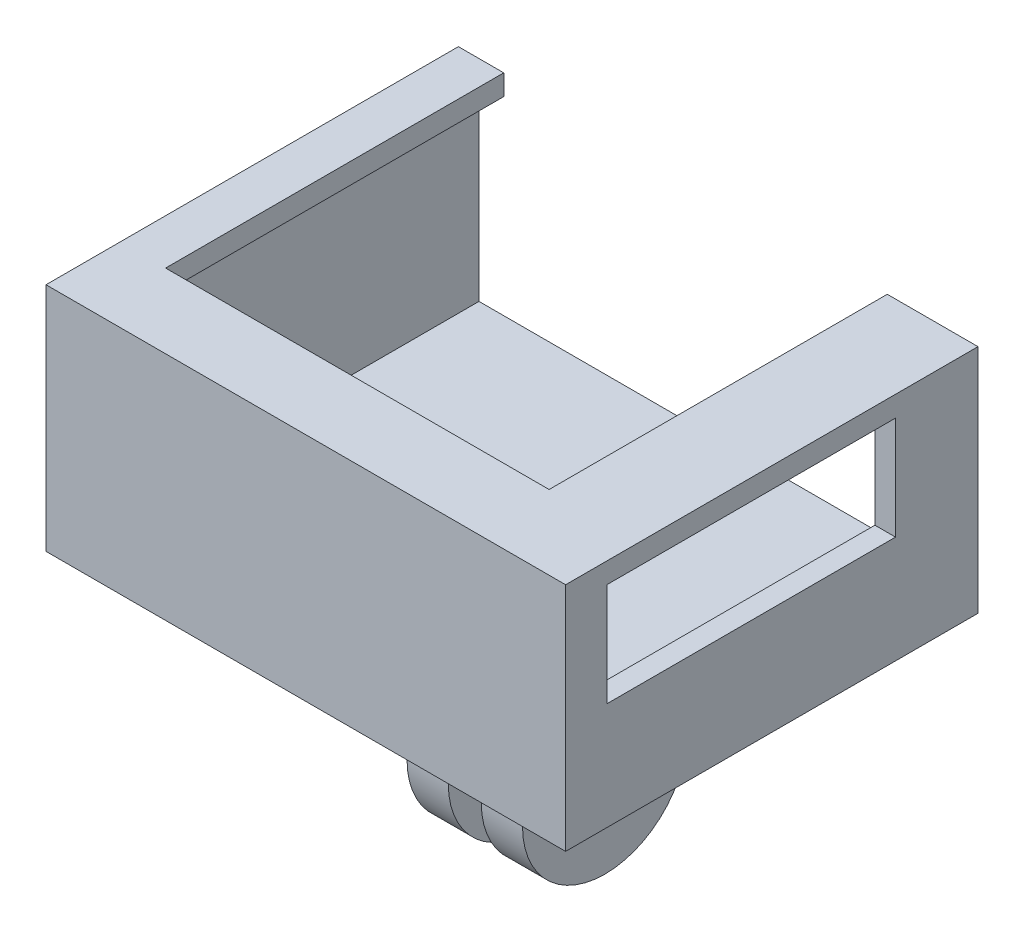
ISO-10303-21;
HEADER;
FILE_DESCRIPTION(('STEP AP214'),'2;1');
FILE_NAME('part.step','',(''),(''),'','','');
FILE_SCHEMA(('AUTOMOTIVE_DESIGN { 1 0 10303 214 1 1 1 1 }'));
ENDSEC;
DATA;
#1=APPLICATION_CONTEXT('core data for automotive mechanical design processes');
#2=APPLICATION_PROTOCOL_DEFINITION('international standard','automotive_design',2000,#1);
#3=PRODUCT_CONTEXT('',#1,'mechanical');
#4=PRODUCT('Part','Part','',(#3));
#5=PRODUCT_RELATED_PRODUCT_CATEGORY('part','',(#4));
#6=PRODUCT_DEFINITION_FORMATION('','',#4);
#7=PRODUCT_DEFINITION_CONTEXT('part definition',#1,'design');
#8=PRODUCT_DEFINITION('design','',#6,#7);
#9=PRODUCT_DEFINITION_SHAPE('','',#8);
#10=(LENGTH_UNIT() NAMED_UNIT(*) SI_UNIT(.MILLI.,.METRE.));
#11=(NAMED_UNIT(*) PLANE_ANGLE_UNIT() SI_UNIT($,.RADIAN.));
#12=(NAMED_UNIT(*) SI_UNIT($,.STERADIAN.) SOLID_ANGLE_UNIT());
#13=UNCERTAINTY_MEASURE_WITH_UNIT(LENGTH_MEASURE(1.E-05),#10,'distance_accuracy_value','');
#14=(GEOMETRIC_REPRESENTATION_CONTEXT(3) GLOBAL_UNCERTAINTY_ASSIGNED_CONTEXT((#13)) GLOBAL_UNIT_ASSIGNED_CONTEXT((#10,
#11,#12)) REPRESENTATION_CONTEXT('',''));
#15=CARTESIAN_POINT('',(0.,0.,0.));
#16=DIRECTION('',(0.,0.,1.));
#17=DIRECTION('',(1.,0.,0.));
#18=AXIS2_PLACEMENT_3D('',#15,#16,#17);
#19=CARTESIAN_POINT('',(-23.2752097090962,0.,0.));
#20=DIRECTION('',(1.,0.,0.));
#21=DIRECTION('',(0.,0.,-1.));
#22=AXIS2_PLACEMENT_3D('',#19,#20,#21);
#23=PLANE('',#22);
#24=DIRECTION('',(0.,0.,1.));
#25=VECTOR('',#24,1.);
#26=CARTESIAN_POINT('',(-23.2752097090962,28.,-41.5771910830995));
#27=LINE('',#26,#25);
#28=CARTESIAN_POINT('',(-23.2752097090962,28.,-15.9549351324616));
#29=VERTEX_POINT('',#28);
#30=CARTESIAN_POINT('',(-23.2752097090962,28.,25.0450648675384));
#31=VERTEX_POINT('',#30);
#32=EDGE_CURVE('E190',#29,#31,#27,.T.);
#33=ORIENTED_EDGE('',*,*,#32,.T.);
#34=DIRECTION('',(0.,1.,0.));
#35=VECTOR('',#34,1.);
#36=CARTESIAN_POINT('',(-23.2752097090962,25.5,25.0450648675384));
#37=LINE('',#36,#35);
#38=CARTESIAN_POINT('',(-23.2752097090962,25.5,25.0450648675384));
#39=VERTEX_POINT('',#38);
#40=EDGE_CURVE('E192',#39,#31,#37,.T.);
#41=ORIENTED_EDGE('',*,*,#40,.F.);
#42=DIRECTION('',(0.,0.,-1.));
#43=VECTOR('',#42,1.);
#44=CARTESIAN_POINT('',(-23.2752097090962,25.5,-41.5771910830995));
#45=LINE('',#44,#43);
#46=CARTESIAN_POINT('',(-23.2752097090962,25.5,-15.9549351324616));
#47=VERTEX_POINT('',#46);
#48=EDGE_CURVE('E224',#39,#47,#45,.T.);
#49=ORIENTED_EDGE('',*,*,#48,.T.);
#50=DIRECTION('',(0.,1.,0.));
#51=VECTOR('',#50,1.);
#52=CARTESIAN_POINT('',(-23.2752097090962,2.5,-15.9549351324616));
#53=LINE('',#52,#51);
#54=EDGE_CURVE('E195',#47,#29,#53,.T.);
#55=ORIENTED_EDGE('',*,*,#54,.T.);
#56=EDGE_LOOP('',(#33,#41,#49,#55));
#57=FACE_BOUND('',#56,.T.);
#58=ADVANCED_FACE('F34',(#57),#23,.T.);
#59=CARTESIAN_POINT('',(23.2247902909038,0.,0.));
#60=DIRECTION('',(1.,0.,0.));
#61=DIRECTION('',(0.,0.,-1.));
#62=AXIS2_PLACEMENT_3D('',#59,#60,#61);
#63=PLANE('',#62);
#64=DIRECTION('',(0.,0.,1.));
#65=VECTOR('',#64,1.);
#66=CARTESIAN_POINT('',(23.2247902909038,25.5,-15.9549351324616));
#67=LINE('',#66,#65);
#68=CARTESIAN_POINT('',(23.2247902909038,25.5,-15.9549351324616));
#69=VERTEX_POINT('',#68);
#70=CARTESIAN_POINT('',(23.2247902909038,25.5,25.0450648675384));
#71=VERTEX_POINT('',#70);
#72=EDGE_CURVE('E221',#69,#71,#67,.T.);
#73=ORIENTED_EDGE('',*,*,#72,.T.);
#74=DIRECTION('',(0.,-1.,0.));
#75=VECTOR('',#74,1.);
#76=CARTESIAN_POINT('',(23.2247902909038,25.5,25.0450648675384));
#77=LINE('',#76,#75);
#78=CARTESIAN_POINT('',(23.2247902909038,28.,25.0450648675384));
#79=VERTEX_POINT('',#78);
#80=EDGE_CURVE('E213',#79,#71,#77,.T.);
#81=ORIENTED_EDGE('',*,*,#80,.F.);
#82=DIRECTION('',(0.,0.,-1.));
#83=VECTOR('',#82,1.);
#84=CARTESIAN_POINT('',(23.2247902909038,28.,-15.9549351324616));
#85=LINE('',#84,#83);
#86=CARTESIAN_POINT('',(23.2247902909038,28.,-15.9549351324616));
#87=VERTEX_POINT('',#86);
#88=EDGE_CURVE('E211',#79,#87,#85,.T.);
#89=ORIENTED_EDGE('',*,*,#88,.T.);
#90=DIRECTION('',(0.,-1.,0.));
#91=VECTOR('',#90,1.);
#92=CARTESIAN_POINT('',(23.2247902909038,25.5,-15.9549351324616));
#93=LINE('',#92,#91);
#94=EDGE_CURVE('E218',#87,#69,#93,.T.);
#95=ORIENTED_EDGE('',*,*,#94,.T.);
#96=EDGE_LOOP('',(#73,#81,#89,#95));
#97=FACE_BOUND('',#96,.T.);
#98=ADVANCED_FACE('F414',(#97),#63,.F.);
#99=CARTESIAN_POINT('',(0.,0.,29.0450648675384));
#100=DIRECTION('',(0.,0.,1.));
#101=DIRECTION('',(1.,0.,0.));
#102=AXIS2_PLACEMENT_3D('',#99,#100,#101);
#103=PLANE('',#102);
#104=DIRECTION('',(1.,0.,0.));
#105=VECTOR('',#104,1.);
#106=CARTESIAN_POINT('',(-28.2752097090962,2.5,29.0450648675384));
#107=LINE('',#106,#105);
#108=CARTESIAN_POINT('',(-26.2752097090962,2.5,29.0450648675384));
#109=VERTEX_POINT('',#108);
#110=CARTESIAN_POINT('',(31.7247902909038,2.5,29.0450648675384));
#111=VERTEX_POINT('',#110);
#112=EDGE_CURVE('E322',#109,#111,#107,.T.);
#113=ORIENTED_EDGE('',*,*,#112,.F.);
#114=DIRECTION('',(0.,-1.,0.));
#115=VECTOR('',#114,1.);
#116=CARTESIAN_POINT('',(-26.2752097090962,25.5,29.0450648675384));
#117=LINE('',#116,#115);
#118=CARTESIAN_POINT('',(-26.2752097090962,25.5,29.0450648675384));
#119=VERTEX_POINT('',#118);
#120=EDGE_CURVE('E244',#119,#109,#117,.T.);
#121=ORIENTED_EDGE('',*,*,#120,.F.);
#122=DIRECTION('',(1.,0.,0.));
#123=VECTOR('',#122,1.);
#124=CARTESIAN_POINT('',(-26.2752097090962,25.5,29.0450648675384));
#125=LINE('',#124,#123);
#126=CARTESIAN_POINT('',(34.2247902909038,25.5,29.0450648675384));
#127=VERTEX_POINT('',#126);
#128=EDGE_CURVE('E237',#119,#127,#125,.T.);
#129=ORIENTED_EDGE('',*,*,#128,.T.);
#130=DIRECTION('',(0.,-1.,0.));
#131=VECTOR('',#130,1.);
#132=CARTESIAN_POINT('',(34.2247902909038,13.,29.0450648675384));
#133=LINE('',#132,#131);
#134=CARTESIAN_POINT('',(34.2247902909038,13.,29.0450648675384));
#135=VERTEX_POINT('',#134);
#136=EDGE_CURVE('E299',#127,#135,#133,.T.);
#137=ORIENTED_EDGE('',*,*,#136,.T.);
#138=DIRECTION('',(-1.,0.,0.));
#139=VECTOR('',#138,1.);
#140=CARTESIAN_POINT('',(50.0361785917457,13.,29.0450648675384));
#141=LINE('',#140,#139);
#142=CARTESIAN_POINT('',(31.7247902909038,13.,29.0450648675384));
#143=VERTEX_POINT('',#142);
#144=EDGE_CURVE('E298',#135,#143,#141,.T.);
#145=ORIENTED_EDGE('',*,*,#144,.T.);
#146=DIRECTION('',(0.,1.,0.));
#147=VECTOR('',#146,1.);
#148=CARTESIAN_POINT('',(31.7247902909038,22.5,29.0450648675384));
#149=LINE('',#148,#147);
#150=EDGE_CURVE('E326',#111,#143,#149,.T.);
#151=ORIENTED_EDGE('',*,*,#150,.F.);
#152=EDGE_LOOP('',(#113,#121,#129,#137,#145,#151));
#153=FACE_BOUND('',#152,.T.);
#154=ADVANCED_FACE('F399',(#153),#103,.F.);
#155=CARTESIAN_POINT('',(-28.2752097090962,2.5,-15.9549351324616));
#156=DIRECTION('',(0.,-1.,0.));
#157=DIRECTION('',(0.,0.,-1.));
#158=AXIS2_PLACEMENT_3D('',#155,#156,#157);
#159=PLANE('',#158);
#160=DIRECTION('',(0.,0.,1.));
#161=VECTOR('',#160,1.);
#162=CARTESIAN_POINT('',(-26.2752097090962,2.5,-41.5771910830995));
#163=LINE('',#162,#161);
#164=CARTESIAN_POINT('',(-26.2752097090962,2.5,-15.9549351324616));
#165=VERTEX_POINT('',#164);
#166=EDGE_CURVE('E310',#165,#109,#163,.T.);
#167=ORIENTED_EDGE('',*,*,#166,.T.);
#168=ORIENTED_EDGE('',*,*,#112,.T.);
#169=DIRECTION('',(0.,0.,1.));
#170=VECTOR('',#169,1.);
#171=CARTESIAN_POINT('',(31.7247902909038,2.5,-15.9549351324616));
#172=LINE('',#171,#170);
#173=CARTESIAN_POINT('',(31.7247902909038,2.5,-15.9549351324616));
#174=VERTEX_POINT('',#173);
#175=EDGE_CURVE('E329',#174,#111,#172,.T.);
#176=ORIENTED_EDGE('',*,*,#175,.F.);
#177=DIRECTION('',(1.,0.,0.));
#178=VECTOR('',#177,1.);
#179=CARTESIAN_POINT('',(-28.2752097090962,2.5,-15.9549351324616));
#180=LINE('',#179,#178);
#181=EDGE_CURVE('E323',#165,#174,#180,.T.);
#182=ORIENTED_EDGE('',*,*,#181,.F.);
#183=EDGE_LOOP('',(#167,#168,#176,#182));
#184=FACE_BOUND('',#183,.T.);
#185=ADVANCED_FACE('F396',(#184),#159,.F.);
#186=CARTESIAN_POINT('',(-26.2752097090962,2.5,-41.5771910830995));
#187=DIRECTION('',(-1.,0.,0.));
#188=DIRECTION('',(0.,0.,1.));
#189=AXIS2_PLACEMENT_3D('',#186,#187,#188);
#190=PLANE('',#189);
#191=DIRECTION('',(0.,1.,0.));
#192=VECTOR('',#191,1.);
#193=CARTESIAN_POINT('',(-26.2752097090962,2.5,-15.9549351324616));
#194=LINE('',#193,#192);
#195=CARTESIAN_POINT('',(-26.2752097090962,25.5,-15.9549351324616));
#196=VERTEX_POINT('',#195);
#197=EDGE_CURVE('E311',#165,#196,#194,.T.);
#198=ORIENTED_EDGE('',*,*,#197,.T.);
#199=DIRECTION('',(0.,0.,1.));
#200=VECTOR('',#199,1.);
#201=CARTESIAN_POINT('',(-26.2752097090962,25.5,-15.9549351324616));
#202=LINE('',#201,#200);
#203=EDGE_CURVE('E235',#196,#119,#202,.T.);
#204=ORIENTED_EDGE('',*,*,#203,.T.);
#205=ORIENTED_EDGE('',*,*,#120,.T.);
#206=ORIENTED_EDGE('',*,*,#166,.F.);
#207=EDGE_LOOP('',(#198,#204,#205,#206));
#208=FACE_BOUND('',#207,.T.);
#209=ADVANCED_FACE('F386',(#208),#190,.F.);
#210=CARTESIAN_POINT('',(-28.7752097090962,28.,-15.9549351324616));
#211=DIRECTION('',(0.,0.,1.));
#212=DIRECTION('',(1.,0.,0.));
#213=AXIS2_PLACEMENT_3D('',#210,#211,#212);
#214=PLANE('',#213);
#215=DIRECTION('',(0.,1.,0.));
#216=VECTOR('',#215,1.);
#217=CARTESIAN_POINT('',(31.7247902909038,22.5,-15.9549351324616));
#218=LINE('',#217,#216);
#219=CARTESIAN_POINT('',(31.7247902909038,25.5,-15.9549351324616));
#220=VERTEX_POINT('',#219);
#221=EDGE_CURVE('E325',#174,#220,#218,.T.);
#222=ORIENTED_EDGE('',*,*,#221,.T.);
#223=DIRECTION('',(-1.,0.,0.));
#224=VECTOR('',#223,1.);
#225=CARTESIAN_POINT('',(-26.2752097090962,25.5,-15.9549351324616));
#226=LINE('',#225,#224);
#227=EDGE_CURVE('E242',#220,#69,#226,.T.);
#228=ORIENTED_EDGE('',*,*,#227,.T.);
#229=ORIENTED_EDGE('',*,*,#94,.F.);
#230=DIRECTION('',(-1.,0.,0.));
#231=VECTOR('',#230,1.);
#232=CARTESIAN_POINT('',(-28.7752097090962,28.,-15.9549351324616));
#233=LINE('',#232,#231);
#234=CARTESIAN_POINT('',(34.2247902909038,28.,-15.9549351324616));
#235=VERTEX_POINT('',#234);
#236=EDGE_CURVE('E344',#235,#87,#233,.T.);
#237=ORIENTED_EDGE('',*,*,#236,.F.);
#238=DIRECTION('',(0.,-1.,0.));
#239=VECTOR('',#238,1.);
#240=CARTESIAN_POINT('',(34.2247902909038,28.,-15.9549351324616));
#241=LINE('',#240,#239);
#242=CARTESIAN_POINT('',(34.2247902909038,0.,-15.9549351324616));
#243=VERTEX_POINT('',#242);
#244=EDGE_CURVE('E357',#235,#243,#241,.T.);
#245=ORIENTED_EDGE('',*,*,#244,.T.);
#246=DIRECTION('',(-1.,0.,0.));
#247=VECTOR('',#246,1.);
#248=CARTESIAN_POINT('',(-28.7752097090962,0.,-15.9549351324616));
#249=LINE('',#248,#247);
#250=CARTESIAN_POINT('',(-28.7752097090962,0.,-15.9549351324616));
#251=VERTEX_POINT('',#250);
#252=EDGE_CURVE('E339',#243,#251,#249,.T.);
#253=ORIENTED_EDGE('',*,*,#252,.T.);
#254=DIRECTION('',(0.,-1.,0.));
#255=VECTOR('',#254,1.);
#256=CARTESIAN_POINT('',(-28.7752097090962,28.,-15.9549351324616));
#257=LINE('',#256,#255);
#258=CARTESIAN_POINT('',(-28.7752097090962,28.,-15.9549351324616));
#259=VERTEX_POINT('',#258);
#260=EDGE_CURVE('E346',#259,#251,#257,.T.);
#261=ORIENTED_EDGE('',*,*,#260,.F.);
#262=DIRECTION('',(-1.,0.,0.));
#263=VECTOR('',#262,1.);
#264=CARTESIAN_POINT('',(-28.7752097090962,28.,-15.9549351324616));
#265=LINE('',#264,#263);
#266=EDGE_CURVE('E314',#29,#259,#265,.T.);
#267=ORIENTED_EDGE('',*,*,#266,.F.);
#268=ORIENTED_EDGE('',*,*,#54,.F.);
#269=DIRECTION('',(-1.,0.,0.));
#270=VECTOR('',#269,1.);
#271=CARTESIAN_POINT('',(-23.2752097090962,25.5,-15.9549351324616));
#272=LINE('',#271,#270);
#273=EDGE_CURVE('E199',#47,#196,#272,.T.);
#274=ORIENTED_EDGE('',*,*,#273,.T.);
#275=ORIENTED_EDGE('',*,*,#197,.F.);
#276=ORIENTED_EDGE('',*,*,#181,.T.);
#277=EDGE_LOOP('',(#222,#228,#229,#237,#245,#253,#261,#267,#268,#274,#275,#276));
#278=FACE_BOUND('',#277,.T.);
#279=ADVANCED_FACE('F374',(#278),#214,.F.);
#280=CARTESIAN_POINT('',(11.2247902909038,-31.4705755029261,-5.95493513246163));
#281=DIRECTION('',(0.,0.,-1.));
#282=DIRECTION('',(-1.,0.,0.));
#283=AXIS2_PLACEMENT_3D('',#280,#281,#282);
#284=PLANE('',#283);
#285=DIRECTION('',(0.,1.,0.));
#286=VECTOR('',#285,1.);
#287=CARTESIAN_POINT('',(34.2247902909038,-31.4705755029261,-5.95493513246163));
#288=LINE('',#287,#286);
#289=CARTESIAN_POINT('',(34.2247902909038,13.,-5.95493513246163));
#290=VERTEX_POINT('',#289);
#291=CARTESIAN_POINT('',(34.2247902909038,25.5,-5.95493513246163));
#292=VERTEX_POINT('',#291);
#293=EDGE_CURVE('E316',#290,#292,#288,.T.);
#294=ORIENTED_EDGE('',*,*,#293,.T.);
#295=DIRECTION('',(1.,0.,0.));
#296=VECTOR('',#295,1.);
#297=CARTESIAN_POINT('',(31.7247902909038,25.5,-5.95493513246163));
#298=LINE('',#297,#296);
#299=CARTESIAN_POINT('',(31.7247902909038,25.5,-5.95493513246163));
#300=VERTEX_POINT('',#299);
#301=EDGE_CURVE('E229',#300,#292,#298,.T.);
#302=ORIENTED_EDGE('',*,*,#301,.F.);
#303=DIRECTION('',(0.,1.,0.));
#304=VECTOR('',#303,1.);
#305=CARTESIAN_POINT('',(31.7247902909038,22.5,-5.95493513246163));
#306=LINE('',#305,#304);
#307=CARTESIAN_POINT('',(31.7247902909038,13.,-5.95493513246163));
#308=VERTEX_POINT('',#307);
#309=EDGE_CURVE('E320',#308,#300,#306,.T.);
#310=ORIENTED_EDGE('',*,*,#309,.F.);
#311=DIRECTION('',(1.,0.,0.));
#312=VECTOR('',#311,1.);
#313=CARTESIAN_POINT('',(31.7247902909038,13.,-5.95493513246163));
#314=LINE('',#313,#312);
#315=EDGE_CURVE('E301',#308,#290,#314,.T.);
#316=ORIENTED_EDGE('',*,*,#315,.T.);
#317=EDGE_LOOP('',(#294,#302,#310,#316));
#318=FACE_BOUND('',#317,.T.);
#319=ADVANCED_FACE('F406',(#318),#284,.F.);
#320=CARTESIAN_POINT('',(34.2247902909038,28.,-15.9549351324616));
#321=DIRECTION('',(-1.,0.,0.));
#322=DIRECTION('',(0.,0.,1.));
#323=AXIS2_PLACEMENT_3D('',#320,#321,#322);
#324=PLANE('',#323);
#325=ORIENTED_EDGE('',*,*,#136,.F.);
#326=DIRECTION('',(0.,0.,1.));
#327=VECTOR('',#326,1.);
#328=CARTESIAN_POINT('',(34.2247902909038,25.5,-5.95493513246163));
#329=LINE('',#328,#327);
#330=EDGE_CURVE('E232',#292,#127,#329,.T.);
#331=ORIENTED_EDGE('',*,*,#330,.F.);
#332=ORIENTED_EDGE('',*,*,#293,.F.);
#333=DIRECTION('',(0.,0.,-1.));
#334=VECTOR('',#333,1.);
#335=CARTESIAN_POINT('',(34.2247902909038,13.,34.0450648675384));
#336=LINE('',#335,#334);
#337=EDGE_CURVE('E306',#135,#290,#336,.T.);
#338=ORIENTED_EDGE('',*,*,#337,.F.);
#339=EDGE_LOOP('',(#325,#331,#332,#338));
#340=FACE_BOUND('',#339,.T.);
#341=DIRECTION('',(0.,0.,-1.));
#342=VECTOR('',#341,1.);
#343=CARTESIAN_POINT('',(34.2247902909038,28.,-15.9549351324616));
#344=LINE('',#343,#342);
#345=CARTESIAN_POINT('',(34.2247902909038,28.,34.0450648675384));
#346=VERTEX_POINT('',#345);
#347=EDGE_CURVE('E342',#346,#235,#344,.T.);
#348=ORIENTED_EDGE('',*,*,#347,.F.);
#349=DIRECTION('',(0.,-1.,0.));
#350=VECTOR('',#349,1.);
#351=CARTESIAN_POINT('',(34.2247902909038,28.,34.0450648675384));
#352=LINE('',#351,#350);
#353=CARTESIAN_POINT('',(34.2247902909038,0.,34.0450648675384));
#354=VERTEX_POINT('',#353);
#355=EDGE_CURVE('E42',#346,#354,#352,.T.);
#356=ORIENTED_EDGE('',*,*,#355,.T.);
#357=DIRECTION('',(0.,0.,-1.));
#358=VECTOR('',#357,1.);
#359=CARTESIAN_POINT('',(34.2247902909038,0.,-15.9549351324616));
#360=LINE('',#359,#358);
#361=EDGE_CURVE('E352',#354,#243,#360,.T.);
#362=ORIENTED_EDGE('',*,*,#361,.T.);
#363=ORIENTED_EDGE('',*,*,#244,.F.);
#364=EDGE_LOOP('',(#348,#356,#362,#363));
#365=FACE_BOUND('',#364,.T.);
#366=ADVANCED_FACE('F361',(#340,#365),#324,.F.);
#367=CARTESIAN_POINT('',(20.,0.,-0.954935132461632));
#368=DIRECTION('',(0.,0.,1.));
#369=DIRECTION('',(0.,-1.,0.));
#370=AXIS2_PLACEMENT_3D('',#367,#368,#369);
#371=PLANE('',#370);
#372=DIRECTION('',(0.,-1.,0.));
#373=VECTOR('',#372,1.);
#374=CARTESIAN_POINT('',(14.,0.,-0.954935132461632));
#375=LINE('',#374,#373);
#376=CARTESIAN_POINT('',(14.,0.,-0.954935132461632));
#377=VERTEX_POINT('',#376);
#378=CARTESIAN_POINT('',(14.,-15.0000000000001,-0.954935132461632));
#379=VERTEX_POINT('',#378);
#380=EDGE_CURVE('E251',#377,#379,#375,.T.);
#381=ORIENTED_EDGE('',*,*,#380,.T.);
#382=DIRECTION('',(-1.,0.,0.));
#383=VECTOR('',#382,1.);
#384=CARTESIAN_POINT('',(20.,-15.,-0.954935132461632));
#385=LINE('',#384,#383);
#386=CARTESIAN_POINT('',(9.,-15.,-0.954935132461632));
#387=VERTEX_POINT('',#386);
#388=EDGE_CURVE('E287',#379,#387,#385,.T.);
#389=ORIENTED_EDGE('',*,*,#388,.T.);
#390=DIRECTION('',(0.,-1.,0.));
#391=VECTOR('',#390,1.);
#392=CARTESIAN_POINT('',(9.,0.,-0.954935132461632));
#393=LINE('',#392,#391);
#394=CARTESIAN_POINT('',(9.,0.,-0.954935132461632));
#395=VERTEX_POINT('',#394);
#396=EDGE_CURVE('E265',#395,#387,#393,.T.);
#397=ORIENTED_EDGE('',*,*,#396,.F.);
#398=DIRECTION('',(-1.,0.,0.));
#399=VECTOR('',#398,1.);
#400=CARTESIAN_POINT('',(20.,0.,-0.954935132461632));
#401=LINE('',#400,#399);
#402=EDGE_CURVE('E296',#377,#395,#401,.T.);
#403=ORIENTED_EDGE('',*,*,#402,.F.);
#404=EDGE_LOOP('',(#381,#389,#397,#403));
#405=FACE_BOUND('',#404,.T.);
#406=ADVANCED_FACE('F450',(#405),#371,.F.);
#407=CARTESIAN_POINT('',(20.,0.,19.0450648675384));
#408=DIRECTION('',(0.,0.,-1.));
#409=DIRECTION('',(0.,1.,0.));
#410=AXIS2_PLACEMENT_3D('',#407,#408,#409);
#411=PLANE('',#410);
#412=DIRECTION('',(0.,1.,0.));
#413=VECTOR('',#412,1.);
#414=CARTESIAN_POINT('',(14.,-15.,19.0450648675384));
#415=LINE('',#414,#413);
#416=CARTESIAN_POINT('',(14.,-15.,19.0450648675384));
#417=VERTEX_POINT('',#416);
#418=CARTESIAN_POINT('',(14.,0.,19.0450648675384));
#419=VERTEX_POINT('',#418);
#420=EDGE_CURVE('E49',#417,#419,#415,.T.);
#421=ORIENTED_EDGE('',*,*,#420,.T.);
#422=DIRECTION('',(-1.,0.,0.));
#423=VECTOR('',#422,1.);
#424=CARTESIAN_POINT('',(20.,0.,19.0450648675384));
#425=LINE('',#424,#423);
#426=CARTESIAN_POINT('',(9.,0.,19.0450648675384));
#427=VERTEX_POINT('',#426);
#428=EDGE_CURVE('E293',#419,#427,#425,.T.);
#429=ORIENTED_EDGE('',*,*,#428,.T.);
#430=DIRECTION('',(0.,1.,0.));
#431=VECTOR('',#430,1.);
#432=CARTESIAN_POINT('',(9.,-15.,19.0450648675384));
#433=LINE('',#432,#431);
#434=CARTESIAN_POINT('',(9.,-15.,19.0450648675384));
#435=VERTEX_POINT('',#434);
#436=EDGE_CURVE('E258',#435,#427,#433,.T.);
#437=ORIENTED_EDGE('',*,*,#436,.F.);
#438=DIRECTION('',(-1.,0.,0.));
#439=VECTOR('',#438,1.);
#440=CARTESIAN_POINT('',(20.,-15.,19.0450648675384));
#441=LINE('',#440,#439);
#442=EDGE_CURVE('E290',#417,#435,#441,.T.);
#443=ORIENTED_EDGE('',*,*,#442,.F.);
#444=EDGE_LOOP('',(#421,#429,#437,#443));
#445=FACE_BOUND('',#444,.T.);
#446=ADVANCED_FACE('F445',(#445),#411,.F.);
#447=CARTESIAN_POINT('',(20.,-15.,9.04506486753837));
#448=DIRECTION('',(-1.,0.,0.));
#449=DIRECTION('',(0.,0.,1.));
#450=AXIS2_PLACEMENT_3D('',#447,#448,#449);
#451=CYLINDRICAL_SURFACE('',#450,10.);
#452=CARTESIAN_POINT('',(14.,-15.,9.04506486753837));
#453=DIRECTION('',(-1.,0.,0.));
#454=DIRECTION('',(0.,0.,-1.));
#455=AXIS2_PLACEMENT_3D('',#452,#453,#454);
#456=CIRCLE('',#455,10.);
#457=EDGE_CURVE('E246',#379,#417,#456,.T.);
#458=ORIENTED_EDGE('',*,*,#457,.T.);
#459=ORIENTED_EDGE('',*,*,#442,.T.);
#460=CARTESIAN_POINT('',(9.,-15.,9.04506486753837));
#461=DIRECTION('',(-1.,0.,0.));
#462=DIRECTION('',(0.,0.,-1.));
#463=AXIS2_PLACEMENT_3D('',#460,#461,#462);
#464=CIRCLE('',#463,10.);
#465=EDGE_CURVE('E255',#387,#435,#464,.T.);
#466=ORIENTED_EDGE('',*,*,#465,.F.);
#467=ORIENTED_EDGE('',*,*,#388,.F.);
#468=EDGE_LOOP('',(#458,#459,#466,#467));
#469=FACE_BOUND('',#468,.T.);
#470=ADVANCED_FACE('F441',(#469),#451,.T.);
#471=DIRECTION('',(0.,-1.,0.));
#472=VECTOR('',#471,1.);
#473=CARTESIAN_POINT('',(5.,0.,-0.954935132461632));
#474=LINE('',#473,#472);
#475=CARTESIAN_POINT('',(5.,0.,-0.954935132461632));
#476=VERTEX_POINT('',#475);
#477=CARTESIAN_POINT('',(5.,-15.,-0.954935132461632));
#478=VERTEX_POINT('',#477);
#479=EDGE_CURVE('E259',#476,#478,#474,.T.);
#480=ORIENTED_EDGE('',*,*,#479,.T.);
#481=CARTESIAN_POINT('',(0.,-15.,-0.954935132461632));
#482=VERTEX_POINT('',#481);
#483=EDGE_CURVE('E286',#478,#482,#385,.T.);
#484=ORIENTED_EDGE('',*,*,#483,.T.);
#485=DIRECTION('',(0.,1.,0.));
#486=VECTOR('',#485,1.);
#487=CARTESIAN_POINT('',(0.,0.,-0.954935132461632));
#488=LINE('',#487,#486);
#489=CARTESIAN_POINT('',(0.,0.,-0.954935132461632));
#490=VERTEX_POINT('',#489);
#491=EDGE_CURVE('E268',#482,#490,#488,.T.);
#492=ORIENTED_EDGE('',*,*,#491,.T.);
#493=EDGE_CURVE('E295',#476,#490,#401,.T.);
#494=ORIENTED_EDGE('',*,*,#493,.F.);
#495=EDGE_LOOP('',(#480,#484,#492,#494));
#496=FACE_BOUND('',#495,.T.);
#497=ADVANCED_FACE('F444',(#496),#371,.F.);
#498=DIRECTION('',(0.,1.,0.));
#499=VECTOR('',#498,1.);
#500=CARTESIAN_POINT('',(5.,-15.,19.0450648675384));
#501=LINE('',#500,#499);
#502=CARTESIAN_POINT('',(5.,-15.,19.0450648675384));
#503=VERTEX_POINT('',#502);
#504=CARTESIAN_POINT('',(5.,0.,19.0450648675384));
#505=VERTEX_POINT('',#504);
#506=EDGE_CURVE('E57',#503,#505,#501,.T.);
#507=ORIENTED_EDGE('',*,*,#506,.T.);
#508=CARTESIAN_POINT('',(0.,0.,19.0450648675384));
#509=VERTEX_POINT('',#508);
#510=EDGE_CURVE('E292',#505,#509,#425,.T.);
#511=ORIENTED_EDGE('',*,*,#510,.T.);
#512=DIRECTION('',(0.,-1.,0.));
#513=VECTOR('',#512,1.);
#514=CARTESIAN_POINT('',(0.,0.,19.0450648675384));
#515=LINE('',#514,#513);
#516=CARTESIAN_POINT('',(0.,-15.,19.0450648675384));
#517=VERTEX_POINT('',#516);
#518=EDGE_CURVE('E280',#509,#517,#515,.T.);
#519=ORIENTED_EDGE('',*,*,#518,.T.);
#520=EDGE_CURVE('E289',#503,#517,#441,.T.);
#521=ORIENTED_EDGE('',*,*,#520,.F.);
#522=EDGE_LOOP('',(#507,#511,#519,#521));
#523=FACE_BOUND('',#522,.T.);
#524=ADVANCED_FACE('F452',(#523),#411,.F.);
#525=CARTESIAN_POINT('',(5.,-15.,9.04506486753837));
#526=DIRECTION('',(-1.,0.,0.));
#527=DIRECTION('',(0.,0.,-1.));
#528=AXIS2_PLACEMENT_3D('',#525,#526,#527);
#529=CIRCLE('',#528,10.);
#530=EDGE_CURVE('E254',#478,#503,#529,.T.);
#531=ORIENTED_EDGE('',*,*,#530,.T.);
#532=ORIENTED_EDGE('',*,*,#520,.T.);
#533=CARTESIAN_POINT('',(0.,-15.,9.04506486753837));
#534=DIRECTION('',(1.,0.,0.));
#535=DIRECTION('',(0.,0.,1.));
#536=AXIS2_PLACEMENT_3D('',#533,#534,#535);
#537=CIRCLE('',#536,10.);
#538=EDGE_CURVE('E283',#517,#482,#537,.T.);
#539=ORIENTED_EDGE('',*,*,#538,.T.);
#540=ORIENTED_EDGE('',*,*,#483,.F.);
#541=EDGE_LOOP('',(#531,#532,#539,#540));
#542=FACE_BOUND('',#541,.T.);
#543=ADVANCED_FACE('F447',(#542),#451,.T.);
#544=CARTESIAN_POINT('',(-1.81622937159309,13.,34.0450648675384));
#545=DIRECTION('',(0.,-1.,0.));
#546=DIRECTION('',(0.,0.,-1.));
#547=AXIS2_PLACEMENT_3D('',#544,#545,#546);
#548=PLANE('',#547);
#549=ORIENTED_EDGE('',*,*,#144,.F.);
#550=ORIENTED_EDGE('',*,*,#337,.T.);
#551=ORIENTED_EDGE('',*,*,#315,.F.);
#552=DIRECTION('',(0.,0.,1.));
#553=VECTOR('',#552,1.);
#554=CARTESIAN_POINT('',(31.7247902909038,13.,34.0450648675384));
#555=LINE('',#554,#553);
#556=EDGE_CURVE('E308',#308,#143,#555,.T.);
#557=ORIENTED_EDGE('',*,*,#556,.T.);
#558=EDGE_LOOP('',(#549,#550,#551,#557));
#559=FACE_BOUND('',#558,.T.);
#560=ADVANCED_FACE('F408',(#559),#548,.F.);
#561=CARTESIAN_POINT('',(-28.7752097090962,28.,-15.9549351324616));
#562=DIRECTION('',(1.,0.,0.));
#563=DIRECTION('',(0.,0.,-1.));
#564=AXIS2_PLACEMENT_3D('',#561,#562,#563);
#565=PLANE('',#564);
#566=DIRECTION('',(0.,0.,1.));
#567=VECTOR('',#566,1.);
#568=CARTESIAN_POINT('',(-28.7752097090962,28.,-15.9549351324616));
#569=LINE('',#568,#567);
#570=CARTESIAN_POINT('',(-28.7752097090962,28.,34.0450648675384));
#571=VERTEX_POINT('',#570);
#572=EDGE_CURVE('E336',#259,#571,#569,.T.);
#573=ORIENTED_EDGE('',*,*,#572,.F.);
#574=ORIENTED_EDGE('',*,*,#260,.T.);
#575=DIRECTION('',(0.,0.,1.));
#576=VECTOR('',#575,1.);
#577=CARTESIAN_POINT('',(-28.7752097090962,0.,-15.9549351324616));
#578=LINE('',#577,#576);
#579=CARTESIAN_POINT('',(-28.7752097090962,0.,34.0450648675384));
#580=VERTEX_POINT('',#579);
#581=EDGE_CURVE('E335',#251,#580,#578,.T.);
#582=ORIENTED_EDGE('',*,*,#581,.T.);
#583=DIRECTION('',(0.,-1.,0.));
#584=VECTOR('',#583,1.);
#585=CARTESIAN_POINT('',(-28.7752097090962,28.,34.0450648675384));
#586=LINE('',#585,#584);
#587=EDGE_CURVE('E11',#571,#580,#586,.T.);
#588=ORIENTED_EDGE('',*,*,#587,.F.);
#589=EDGE_LOOP('',(#573,#574,#582,#588));
#590=FACE_BOUND('',#589,.T.);
#591=ADVANCED_FACE('F36',(#590),#565,.F.);
#592=CARTESIAN_POINT('',(-28.7752097090962,28.,34.0450648675384));
#593=DIRECTION('',(0.,0.,-1.));
#594=DIRECTION('',(-1.,0.,0.));
#595=AXIS2_PLACEMENT_3D('',#592,#593,#594);
#596=PLANE('',#595);
#597=ORIENTED_EDGE('',*,*,#355,.F.);
#598=DIRECTION('',(1.,0.,0.));
#599=VECTOR('',#598,1.);
#600=CARTESIAN_POINT('',(-28.7752097090962,28.,34.0450648675384));
#601=LINE('',#600,#599);
#602=EDGE_CURVE('E338',#571,#346,#601,.T.);
#603=ORIENTED_EDGE('',*,*,#602,.F.);
#604=ORIENTED_EDGE('',*,*,#587,.T.);
#605=DIRECTION('',(1.,0.,0.));
#606=VECTOR('',#605,1.);
#607=CARTESIAN_POINT('',(-28.7752097090962,0.,34.0450648675384));
#608=LINE('',#607,#606);
#609=EDGE_CURVE('E349',#580,#354,#608,.T.);
#610=ORIENTED_EDGE('',*,*,#609,.T.);
#611=EDGE_LOOP('',(#597,#603,#604,#610));
#612=FACE_BOUND('',#611,.T.);
#613=ADVANCED_FACE('F366',(#612),#596,.F.);
#614=CARTESIAN_POINT('',(0.,28.,0.));
#615=DIRECTION('',(0.,1.,0.));
#616=DIRECTION('',(0.,0.,1.));
#617=AXIS2_PLACEMENT_3D('',#614,#615,#616);
#618=PLANE('',#617);
#619=DIRECTION('',(1.,0.,0.));
#620=VECTOR('',#619,1.);
#621=CARTESIAN_POINT('',(-23.2752097090962,28.,25.0450648675384));
#622=LINE('',#621,#620);
#623=EDGE_CURVE('E205',#31,#79,#622,.T.);
#624=ORIENTED_EDGE('',*,*,#623,.F.);
#625=ORIENTED_EDGE('',*,*,#32,.F.);
#626=ORIENTED_EDGE('',*,*,#266,.T.);
#627=ORIENTED_EDGE('',*,*,#572,.T.);
#628=ORIENTED_EDGE('',*,*,#602,.T.);
#629=ORIENTED_EDGE('',*,*,#347,.T.);
#630=ORIENTED_EDGE('',*,*,#236,.T.);
#631=ORIENTED_EDGE('',*,*,#88,.F.);
#632=EDGE_LOOP('',(#624,#625,#626,#627,#628,#629,#630,#631));
#633=FACE_BOUND('',#632,.T.);
#634=ADVANCED_FACE('F209',(#633),#618,.T.);
#635=CARTESIAN_POINT('',(0.,0.,0.));
#636=DIRECTION('',(0.,1.,0.));
#637=DIRECTION('',(0.,0.,1.));
#638=AXIS2_PLACEMENT_3D('',#635,#636,#637);
#639=PLANE('',#638);
#640=ORIENTED_EDGE('',*,*,#252,.F.);
#641=ORIENTED_EDGE('',*,*,#361,.F.);
#642=ORIENTED_EDGE('',*,*,#609,.F.);
#643=ORIENTED_EDGE('',*,*,#581,.F.);
#644=EDGE_LOOP('',(#640,#641,#642,#643));
#645=FACE_BOUND('',#644,.T.);
#646=DIRECTION('',(0.,0.,-1.));
#647=VECTOR('',#646,1.);
#648=CARTESIAN_POINT('',(14.,0.,19.0450648675384));
#649=LINE('',#648,#647);
#650=EDGE_CURVE('E249',#419,#377,#649,.T.);
#651=ORIENTED_EDGE('',*,*,#650,.T.);
#652=ORIENTED_EDGE('',*,*,#402,.T.);
#653=DIRECTION('',(0.,0.,-1.));
#654=VECTOR('',#653,1.);
#655=CARTESIAN_POINT('',(9.,0.,19.0450648675384));
#656=LINE('',#655,#654);
#657=EDGE_CURVE('E262',#427,#395,#656,.T.);
#658=ORIENTED_EDGE('',*,*,#657,.F.);
#659=ORIENTED_EDGE('',*,*,#428,.F.);
#660=EDGE_LOOP('',(#651,#652,#658,#659));
#661=FACE_BOUND('',#660,.T.);
#662=DIRECTION('',(0.,0.,-1.));
#663=VECTOR('',#662,1.);
#664=CARTESIAN_POINT('',(5.,0.,19.0450648675384));
#665=LINE('',#664,#663);
#666=EDGE_CURVE('E271',#505,#476,#665,.T.);
#667=ORIENTED_EDGE('',*,*,#666,.T.);
#668=ORIENTED_EDGE('',*,*,#493,.T.);
#669=DIRECTION('',(0.,0.,1.));
#670=VECTOR('',#669,1.);
#671=CARTESIAN_POINT('',(0.,0.,-0.954935132461632));
#672=LINE('',#671,#670);
#673=EDGE_CURVE('E277',#490,#509,#672,.T.);
#674=ORIENTED_EDGE('',*,*,#673,.T.);
#675=ORIENTED_EDGE('',*,*,#510,.F.);
#676=EDGE_LOOP('',(#667,#668,#674,#675));
#677=FACE_BOUND('',#676,.T.);
#678=ADVANCED_FACE('F371',(#645,#661,#677),#639,.F.);
#679=CARTESIAN_POINT('',(31.7247902909038,22.5,-15.9549351324616));
#680=DIRECTION('',(1.,0.,0.));
#681=DIRECTION('',(0.,0.,-1.));
#682=AXIS2_PLACEMENT_3D('',#679,#680,#681);
#683=PLANE('',#682);
#684=ORIENTED_EDGE('',*,*,#309,.T.);
#685=DIRECTION('',(0.,0.,-1.));
#686=VECTOR('',#685,1.);
#687=CARTESIAN_POINT('',(31.7247902909038,25.5,-15.9549351324616));
#688=LINE('',#687,#686);
#689=EDGE_CURVE('E240',#300,#220,#688,.T.);
#690=ORIENTED_EDGE('',*,*,#689,.T.);
#691=ORIENTED_EDGE('',*,*,#221,.F.);
#692=ORIENTED_EDGE('',*,*,#175,.T.);
#693=ORIENTED_EDGE('',*,*,#150,.T.);
#694=ORIENTED_EDGE('',*,*,#556,.F.);
#695=EDGE_LOOP('',(#684,#690,#691,#692,#693,#694));
#696=FACE_BOUND('',#695,.T.);
#697=ADVANCED_FACE('F393',(#696),#683,.F.);
#698=CARTESIAN_POINT('',(0.,-15.,9.04506486753837));
#699=DIRECTION('',(-1.,0.,0.));
#700=DIRECTION('',(0.,0.,1.));
#701=AXIS2_PLACEMENT_3D('',#698,#699,#700);
#702=PLANE('',#701);
#703=ORIENTED_EDGE('',*,*,#491,.F.);
#704=ORIENTED_EDGE('',*,*,#538,.F.);
#705=ORIENTED_EDGE('',*,*,#518,.F.);
#706=ORIENTED_EDGE('',*,*,#673,.F.);
#707=EDGE_LOOP('',(#703,#704,#705,#706));
#708=FACE_BOUND('',#707,.T.);
#709=ADVANCED_FACE('F434',(#708),#702,.T.);
#710=CARTESIAN_POINT('',(9.,-15.,9.04506486753837));
#711=DIRECTION('',(1.,0.,0.));
#712=DIRECTION('',(0.,0.,-1.));
#713=AXIS2_PLACEMENT_3D('',#710,#711,#712);
#714=PLANE('',#713);
#715=ORIENTED_EDGE('',*,*,#465,.T.);
#716=ORIENTED_EDGE('',*,*,#436,.T.);
#717=ORIENTED_EDGE('',*,*,#657,.T.);
#718=ORIENTED_EDGE('',*,*,#396,.T.);
#719=EDGE_LOOP('',(#715,#716,#717,#718));
#720=FACE_BOUND('',#719,.T.);
#721=ADVANCED_FACE('F431',(#720),#714,.F.);
#722=CARTESIAN_POINT('',(5.,-15.,9.04506486753837));
#723=DIRECTION('',(1.,0.,0.));
#724=DIRECTION('',(0.,0.,-1.));
#725=AXIS2_PLACEMENT_3D('',#722,#723,#724);
#726=PLANE('',#725);
#727=ORIENTED_EDGE('',*,*,#530,.F.);
#728=ORIENTED_EDGE('',*,*,#479,.F.);
#729=ORIENTED_EDGE('',*,*,#666,.F.);
#730=ORIENTED_EDGE('',*,*,#506,.F.);
#731=EDGE_LOOP('',(#727,#728,#729,#730));
#732=FACE_BOUND('',#731,.T.);
#733=ADVANCED_FACE('F430',(#732),#726,.T.);
#734=CARTESIAN_POINT('',(14.,-15.,9.04506486753837));
#735=DIRECTION('',(1.,0.,0.));
#736=DIRECTION('',(0.,0.,-1.));
#737=AXIS2_PLACEMENT_3D('',#734,#735,#736);
#738=PLANE('',#737);
#739=ORIENTED_EDGE('',*,*,#457,.F.);
#740=ORIENTED_EDGE('',*,*,#380,.F.);
#741=ORIENTED_EDGE('',*,*,#650,.F.);
#742=ORIENTED_EDGE('',*,*,#420,.F.);
#743=EDGE_LOOP('',(#739,#740,#741,#742));
#744=FACE_BOUND('',#743,.T.);
#745=ADVANCED_FACE('F427',(#744),#738,.T.);
#746=CARTESIAN_POINT('',(0.,25.5,0.));
#747=DIRECTION('',(0.,1.,0.));
#748=DIRECTION('',(0.,0.,1.));
#749=AXIS2_PLACEMENT_3D('',#746,#747,#748);
#750=PLANE('',#749);
#751=ORIENTED_EDGE('',*,*,#48,.F.);
#752=DIRECTION('',(-1.,0.,0.));
#753=VECTOR('',#752,1.);
#754=CARTESIAN_POINT('',(-23.2752097090962,25.5,25.0450648675384));
#755=LINE('',#754,#753);
#756=EDGE_CURVE('E207',#71,#39,#755,.T.);
#757=ORIENTED_EDGE('',*,*,#756,.F.);
#758=ORIENTED_EDGE('',*,*,#72,.F.);
#759=ORIENTED_EDGE('',*,*,#227,.F.);
#760=ORIENTED_EDGE('',*,*,#689,.F.);
#761=ORIENTED_EDGE('',*,*,#301,.T.);
#762=ORIENTED_EDGE('',*,*,#330,.T.);
#763=ORIENTED_EDGE('',*,*,#128,.F.);
#764=ORIENTED_EDGE('',*,*,#203,.F.);
#765=ORIENTED_EDGE('',*,*,#273,.F.);
#766=EDGE_LOOP('',(#751,#757,#758,#759,#760,#761,#762,#763,#764,#765));
#767=FACE_BOUND('',#766,.T.);
#768=ADVANCED_FACE('F382',(#767),#750,.F.);
#769=CARTESIAN_POINT('',(0.,0.,25.0450648675384));
#770=DIRECTION('',(0.,0.,-1.));
#771=DIRECTION('',(-1.,0.,0.));
#772=AXIS2_PLACEMENT_3D('',#769,#770,#771);
#773=PLANE('',#772);
#774=ORIENTED_EDGE('',*,*,#40,.T.);
#775=ORIENTED_EDGE('',*,*,#623,.T.);
#776=ORIENTED_EDGE('',*,*,#80,.T.);
#777=ORIENTED_EDGE('',*,*,#756,.T.);
#778=EDGE_LOOP('',(#774,#775,#776,#777));
#779=FACE_BOUND('',#778,.T.);
#780=ADVANCED_FACE('F203',(#779),#773,.T.);
#781=CLOSED_SHELL('',(#58,#98,#154,#185,#209,#279,#319,#366,#406,#446,#470,#497,#524,#543,#560,
#591,#613,#634,#678,#697,#709,#721,#733,#745,#768,#780));
#782=MANIFOLD_SOLID_BREP('B2',#781);
#783=ADVANCED_BREP_SHAPE_REPRESENTATION('',(#18,#782),#14);
#784=SHAPE_DEFINITION_REPRESENTATION(#9,#783);
ENDSEC;
END-ISO-10303-21;
